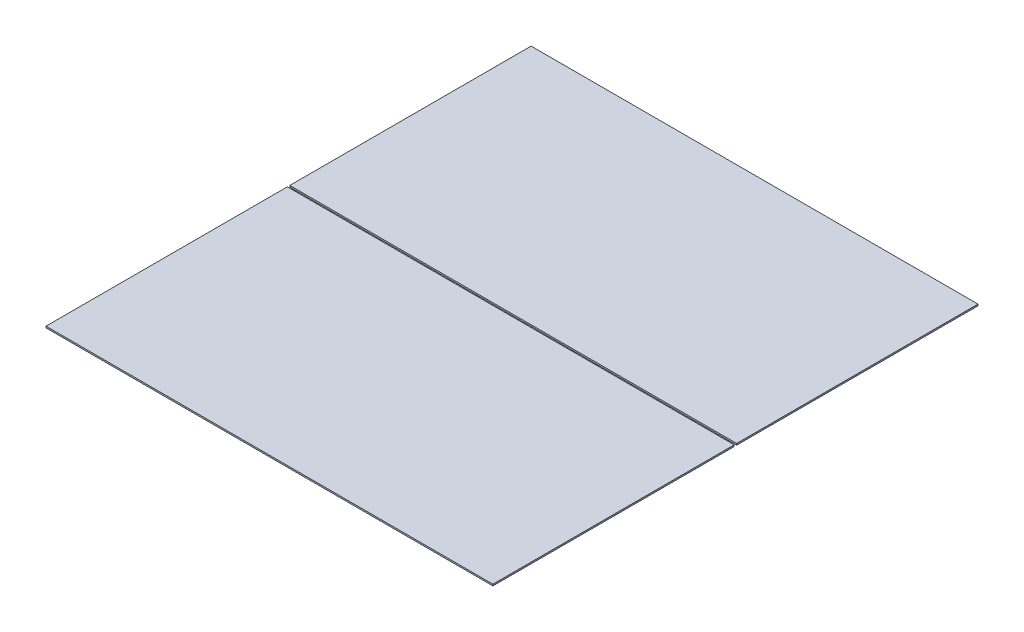
ISO-10303-21;
HEADER;
FILE_DESCRIPTION(('STEP AP214'),'2;1');
FILE_NAME('part.step','',(''),(''),'','','');
FILE_SCHEMA(('AUTOMOTIVE_DESIGN { 1 0 10303 214 1 1 1 1 }'));
ENDSEC;
DATA;
#1=APPLICATION_CONTEXT('core data for automotive mechanical design processes');
#2=APPLICATION_PROTOCOL_DEFINITION('international standard','automotive_design',2000,#1);
#3=PRODUCT_CONTEXT('',#1,'mechanical');
#4=PRODUCT('Part','Part','',(#3));
#5=PRODUCT_RELATED_PRODUCT_CATEGORY('part','',(#4));
#6=PRODUCT_DEFINITION_FORMATION('','',#4);
#7=PRODUCT_DEFINITION_CONTEXT('part definition',#1,'design');
#8=PRODUCT_DEFINITION('design','',#6,#7);
#9=PRODUCT_DEFINITION_SHAPE('','',#8);
#10=(LENGTH_UNIT() NAMED_UNIT(*) SI_UNIT(.MILLI.,.METRE.));
#11=(NAMED_UNIT(*) PLANE_ANGLE_UNIT() SI_UNIT($,.RADIAN.));
#12=(NAMED_UNIT(*) SI_UNIT($,.STERADIAN.) SOLID_ANGLE_UNIT());
#13=UNCERTAINTY_MEASURE_WITH_UNIT(LENGTH_MEASURE(1.E-05),#10,'distance_accuracy_value','');
#14=(GEOMETRIC_REPRESENTATION_CONTEXT(3) GLOBAL_UNCERTAINTY_ASSIGNED_CONTEXT((#13)) GLOBAL_UNIT_ASSIGNED_CONTEXT((#10,
#11,#12)) REPRESENTATION_CONTEXT('',''));
#15=CARTESIAN_POINT('',(0.,0.,0.));
#16=DIRECTION('',(0.,0.,1.));
#17=DIRECTION('',(1.,0.,0.));
#18=AXIS2_PLACEMENT_3D('',#15,#16,#17);
#19=CARTESIAN_POINT('',(0.,-2.5,0.));
#20=DIRECTION('',(0.,-1.,0.));
#21=DIRECTION('',(0.,0.,-1.));
#22=AXIS2_PLACEMENT_3D('',#19,#20,#21);
#23=PLANE('',#22);
#24=DIRECTION('',(0.,0.,-1.));
#25=VECTOR('',#24,1.);
#26=CARTESIAN_POINT('',(742.600000000003,-2.49999999999995,806.1));
#27=LINE('',#26,#25);
#28=CARTESIAN_POINT('',(742.600000000003,-2.49999999999995,806.1));
#29=VERTEX_POINT('',#28);
#30=CARTESIAN_POINT('',(742.600000000003,-2.49999999999995,4.00000000000004));
#31=VERTEX_POINT('',#30);
#32=EDGE_CURVE('E105',#29,#31,#27,.T.);
#33=ORIENTED_EDGE('',*,*,#32,.F.);
#34=DIRECTION('',(1.,0.,0.));
#35=VECTOR('',#34,1.);
#36=CARTESIAN_POINT('',(742.600000000003,-2.49999999999995,806.1));
#37=LINE('',#36,#35);
#38=CARTESIAN_POINT('',(-742.600000000001,-2.49999999999995,806.1));
#39=VERTEX_POINT('',#38);
#40=EDGE_CURVE('E97',#39,#29,#37,.T.);
#41=ORIENTED_EDGE('',*,*,#40,.F.);
#42=DIRECTION('',(0.,0.,1.));
#43=VECTOR('',#42,1.);
#44=CARTESIAN_POINT('',(-742.600000000001,-2.49999999999995,806.1));
#45=LINE('',#44,#43);
#46=CARTESIAN_POINT('',(-742.599999999994,-2.49999999999995,4.00000000000023));
#47=VERTEX_POINT('',#46);
#48=EDGE_CURVE('E83',#47,#39,#45,.T.);
#49=ORIENTED_EDGE('',*,*,#48,.F.);
#50=DIRECTION('',(-1.,0.,0.));
#51=VECTOR('',#50,1.);
#52=CARTESIAN_POINT('',(742.600000000003,-2.49999999999995,4.00000000000004));
#53=LINE('',#52,#51);
#54=EDGE_CURVE('E94',#31,#47,#53,.T.);
#55=ORIENTED_EDGE('',*,*,#54,.F.);
#56=EDGE_LOOP('',(#33,#41,#49,#55));
#57=FACE_BOUND('',#56,.T.);
#58=ADVANCED_FACE('F43',(#57),#23,.T.);
#59=CARTESIAN_POINT('',(742.600000000003,1690.45244305046,806.1));
#60=DIRECTION('',(-1.,0.,0.));
#61=DIRECTION('',(0.,0.,1.));
#62=AXIS2_PLACEMENT_3D('',#59,#60,#61);
#63=PLANE('',#62);
#64=DIRECTION('',(0.,-1.,0.));
#65=VECTOR('',#64,1.);
#66=CARTESIAN_POINT('',(742.600000000003,1690.45244305046,4.00000000000004));
#67=LINE('',#66,#65);
#68=CARTESIAN_POINT('',(742.600000000003,2.49999999999995,4.00000000000004));
#69=VERTEX_POINT('',#68);
#70=EDGE_CURVE('E100',#69,#31,#67,.T.);
#71=ORIENTED_EDGE('',*,*,#70,.F.);
#72=DIRECTION('',(0.,0.,1.));
#73=VECTOR('',#72,1.);
#74=CARTESIAN_POINT('',(742.600000000003,2.49999999999995,806.1));
#75=LINE('',#74,#73);
#76=CARTESIAN_POINT('',(742.600000000003,2.49999999999995,806.1));
#77=VERTEX_POINT('',#76);
#78=EDGE_CURVE('E59',#69,#77,#75,.T.);
#79=ORIENTED_EDGE('',*,*,#78,.T.);
#80=DIRECTION('',(0.,-1.,0.));
#81=VECTOR('',#80,1.);
#82=CARTESIAN_POINT('',(742.600000000003,1690.45244305046,806.1));
#83=LINE('',#82,#81);
#84=EDGE_CURVE('E102',#77,#29,#83,.T.);
#85=ORIENTED_EDGE('',*,*,#84,.T.);
#86=ORIENTED_EDGE('',*,*,#32,.T.);
#87=EDGE_LOOP('',(#71,#79,#85,#86));
#88=FACE_BOUND('',#87,.T.);
#89=ADVANCED_FACE('F117',(#88),#63,.F.);
#90=CARTESIAN_POINT('',(742.600000000003,1690.45244305046,4.00000000000004));
#91=DIRECTION('',(0.,0.,1.));
#92=DIRECTION('',(1.,0.,0.));
#93=AXIS2_PLACEMENT_3D('',#90,#91,#92);
#94=PLANE('',#93);
#95=DIRECTION('',(0.,-1.,0.));
#96=VECTOR('',#95,1.);
#97=CARTESIAN_POINT('',(-742.599999999994,1690.45244305046,4.00000000000023));
#98=LINE('',#97,#96);
#99=CARTESIAN_POINT('',(-742.599999999994,2.49999999999995,4.00000000000023));
#100=VERTEX_POINT('',#99);
#101=EDGE_CURVE('E79',#100,#47,#98,.T.);
#102=ORIENTED_EDGE('',*,*,#101,.F.);
#103=DIRECTION('',(1.,0.,0.));
#104=VECTOR('',#103,1.);
#105=CARTESIAN_POINT('',(742.600000000003,2.49999999999995,4.00000000000004));
#106=LINE('',#105,#104);
#107=EDGE_CURVE('E108',#100,#69,#106,.T.);
#108=ORIENTED_EDGE('',*,*,#107,.T.);
#109=ORIENTED_EDGE('',*,*,#70,.T.);
#110=ORIENTED_EDGE('',*,*,#54,.T.);
#111=EDGE_LOOP('',(#102,#108,#109,#110));
#112=FACE_BOUND('',#111,.T.);
#113=ADVANCED_FACE('F99',(#112),#94,.F.);
#114=CARTESIAN_POINT('',(-742.600000000001,1690.45244305046,806.1));
#115=DIRECTION('',(1.,0.,0.));
#116=DIRECTION('',(0.,0.,-1.));
#117=AXIS2_PLACEMENT_3D('',#114,#115,#116);
#118=PLANE('',#117);
#119=DIRECTION('',(0.,-1.,0.));
#120=VECTOR('',#119,1.);
#121=CARTESIAN_POINT('',(-742.600000000001,1690.45244305046,806.1));
#122=LINE('',#121,#120);
#123=CARTESIAN_POINT('',(-742.600000000001,2.49999999999995,806.1));
#124=VERTEX_POINT('',#123);
#125=EDGE_CURVE('E12',#124,#39,#122,.T.);
#126=ORIENTED_EDGE('',*,*,#125,.F.);
#127=DIRECTION('',(0.,0.,-1.));
#128=VECTOR('',#127,1.);
#129=CARTESIAN_POINT('',(-742.600000000001,2.49999999999995,806.1));
#130=LINE('',#129,#128);
#131=EDGE_CURVE('E85',#124,#100,#130,.T.);
#132=ORIENTED_EDGE('',*,*,#131,.T.);
#133=ORIENTED_EDGE('',*,*,#101,.T.);
#134=ORIENTED_EDGE('',*,*,#48,.T.);
#135=EDGE_LOOP('',(#126,#132,#133,#134));
#136=FACE_BOUND('',#135,.T.);
#137=ADVANCED_FACE('F82',(#136),#118,.F.);
#138=CARTESIAN_POINT('',(742.600000000003,1690.45244305046,806.1));
#139=DIRECTION('',(0.,0.,-1.));
#140=DIRECTION('',(-1.,0.,0.));
#141=AXIS2_PLACEMENT_3D('',#138,#139,#140);
#142=PLANE('',#141);
#143=ORIENTED_EDGE('',*,*,#84,.F.);
#144=DIRECTION('',(-1.,0.,0.));
#145=VECTOR('',#144,1.);
#146=CARTESIAN_POINT('',(742.600000000003,2.49999999999995,806.1));
#147=LINE('',#146,#145);
#148=EDGE_CURVE('E46',#77,#124,#147,.T.);
#149=ORIENTED_EDGE('',*,*,#148,.T.);
#150=ORIENTED_EDGE('',*,*,#125,.T.);
#151=ORIENTED_EDGE('',*,*,#40,.T.);
#152=EDGE_LOOP('',(#143,#149,#150,#151));
#153=FACE_BOUND('',#152,.T.);
#154=ADVANCED_FACE('F115',(#153),#142,.F.);
#155=CARTESIAN_POINT('',(0.,2.5,0.));
#156=DIRECTION('',(0.,-1.,0.));
#157=DIRECTION('',(0.,0.,-1.));
#158=AXIS2_PLACEMENT_3D('',#155,#156,#157);
#159=PLANE('',#158);
#160=ORIENTED_EDGE('',*,*,#107,.F.);
#161=ORIENTED_EDGE('',*,*,#131,.F.);
#162=ORIENTED_EDGE('',*,*,#148,.F.);
#163=ORIENTED_EDGE('',*,*,#78,.F.);
#164=EDGE_LOOP('',(#160,#161,#162,#163));
#165=FACE_BOUND('',#164,.T.);
#166=ADVANCED_FACE('F111',(#165),#159,.F.);
#167=CLOSED_SHELL('',(#58,#89,#113,#137,#154,#166));
#168=MANIFOLD_SOLID_BREP('B2',#167);
#169=CARTESIAN_POINT('',(0.,-2.5,0.));
#170=DIRECTION('',(0.,-1.,0.));
#171=DIRECTION('',(0.,0.,-1.));
#172=AXIS2_PLACEMENT_3D('',#169,#170,#171);
#173=PLANE('',#172);
#174=DIRECTION('',(0.,0.,1.));
#175=VECTOR('',#174,1.);
#176=CARTESIAN_POINT('',(-742.600000000001,-2.49999999999995,-806.1));
#177=LINE('',#176,#175);
#178=CARTESIAN_POINT('',(-742.600000000001,-2.49999999999995,-806.1));
#179=VERTEX_POINT('',#178);
#180=CARTESIAN_POINT('',(-742.599999999993,-2.49999999999995,-3.99999999999996));
#181=VERTEX_POINT('',#180);
#182=EDGE_CURVE('E235',#179,#181,#177,.T.);
#183=ORIENTED_EDGE('',*,*,#182,.F.);
#184=DIRECTION('',(-1.,0.,0.));
#185=VECTOR('',#184,1.);
#186=CARTESIAN_POINT('',(-742.600000000001,-2.49999999999995,-806.1));
#187=LINE('',#186,#185);
#188=CARTESIAN_POINT('',(742.600000000003,-2.49999999999995,-806.1));
#189=VERTEX_POINT('',#188);
#190=EDGE_CURVE('E227',#189,#179,#187,.T.);
#191=ORIENTED_EDGE('',*,*,#190,.F.);
#192=DIRECTION('',(0.,0.,-1.));
#193=VECTOR('',#192,1.);
#194=CARTESIAN_POINT('',(742.600000000003,-2.49999999999995,-806.1));
#195=LINE('',#194,#193);
#196=CARTESIAN_POINT('',(742.600000000003,-2.49999999999995,-4.));
#197=VERTEX_POINT('',#196);
#198=EDGE_CURVE('E213',#197,#189,#195,.T.);
#199=ORIENTED_EDGE('',*,*,#198,.F.);
#200=DIRECTION('',(1.,0.,0.));
#201=VECTOR('',#200,1.);
#202=CARTESIAN_POINT('',(-742.599999999993,-2.49999999999995,-3.99999999999996));
#203=LINE('',#202,#201);
#204=EDGE_CURVE('E224',#181,#197,#203,.T.);
#205=ORIENTED_EDGE('',*,*,#204,.F.);
#206=EDGE_LOOP('',(#183,#191,#199,#205));
#207=FACE_BOUND('',#206,.T.);
#208=ADVANCED_FACE('F173',(#207),#173,.T.);
#209=CARTESIAN_POINT('',(-742.600000000001,1690.45244305046,-806.1));
#210=DIRECTION('',(1.,0.,0.));
#211=DIRECTION('',(0.,0.,-1.));
#212=AXIS2_PLACEMENT_3D('',#209,#210,#211);
#213=PLANE('',#212);
#214=DIRECTION('',(0.,-1.,0.));
#215=VECTOR('',#214,1.);
#216=CARTESIAN_POINT('',(-742.599999999993,1690.45244305046,-3.99999999999996));
#217=LINE('',#216,#215);
#218=CARTESIAN_POINT('',(-742.599999999993,2.49999999999995,-3.99999999999996));
#219=VERTEX_POINT('',#218);
#220=EDGE_CURVE('E230',#219,#181,#217,.T.);
#221=ORIENTED_EDGE('',*,*,#220,.F.);
#222=DIRECTION('',(0.,0.,-1.));
#223=VECTOR('',#222,1.);
#224=CARTESIAN_POINT('',(-742.600000000001,2.49999999999995,-806.1));
#225=LINE('',#224,#223);
#226=CARTESIAN_POINT('',(-742.600000000001,2.49999999999995,-806.1));
#227=VERTEX_POINT('',#226);
#228=EDGE_CURVE('E189',#219,#227,#225,.T.);
#229=ORIENTED_EDGE('',*,*,#228,.T.);
#230=DIRECTION('',(0.,-1.,0.));
#231=VECTOR('',#230,1.);
#232=CARTESIAN_POINT('',(-742.600000000001,1690.45244305046,-806.1));
#233=LINE('',#232,#231);
#234=EDGE_CURVE('E232',#227,#179,#233,.T.);
#235=ORIENTED_EDGE('',*,*,#234,.T.);
#236=ORIENTED_EDGE('',*,*,#182,.T.);
#237=EDGE_LOOP('',(#221,#229,#235,#236));
#238=FACE_BOUND('',#237,.T.);
#239=ADVANCED_FACE('F247',(#238),#213,.F.);
#240=CARTESIAN_POINT('',(-742.599999999993,1690.45244305046,-3.99999999999996));
#241=DIRECTION('',(0.,0.,-1.));
#242=DIRECTION('',(-1.,0.,0.));
#243=AXIS2_PLACEMENT_3D('',#240,#241,#242);
#244=PLANE('',#243);
#245=DIRECTION('',(0.,-1.,0.));
#246=VECTOR('',#245,1.);
#247=CARTESIAN_POINT('',(742.600000000003,1690.45244305046,-4.));
#248=LINE('',#247,#246);
#249=CARTESIAN_POINT('',(742.600000000003,2.49999999999995,-4.));
#250=VERTEX_POINT('',#249);
#251=EDGE_CURVE('E209',#250,#197,#248,.T.);
#252=ORIENTED_EDGE('',*,*,#251,.F.);
#253=DIRECTION('',(-1.,0.,0.));
#254=VECTOR('',#253,1.);
#255=CARTESIAN_POINT('',(-742.599999999993,2.49999999999995,-3.99999999999996));
#256=LINE('',#255,#254);
#257=EDGE_CURVE('E238',#250,#219,#256,.T.);
#258=ORIENTED_EDGE('',*,*,#257,.T.);
#259=ORIENTED_EDGE('',*,*,#220,.T.);
#260=ORIENTED_EDGE('',*,*,#204,.T.);
#261=EDGE_LOOP('',(#252,#258,#259,#260));
#262=FACE_BOUND('',#261,.T.);
#263=ADVANCED_FACE('F229',(#262),#244,.F.);
#264=CARTESIAN_POINT('',(742.600000000003,1690.45244305046,-806.1));
#265=DIRECTION('',(-1.,0.,0.));
#266=DIRECTION('',(0.,0.,1.));
#267=AXIS2_PLACEMENT_3D('',#264,#265,#266);
#268=PLANE('',#267);
#269=DIRECTION('',(0.,-1.,0.));
#270=VECTOR('',#269,1.);
#271=CARTESIAN_POINT('',(742.600000000003,1690.45244305046,-806.1));
#272=LINE('',#271,#270);
#273=CARTESIAN_POINT('',(742.600000000003,2.49999999999995,-806.1));
#274=VERTEX_POINT('',#273);
#275=EDGE_CURVE('E41',#274,#189,#272,.T.);
#276=ORIENTED_EDGE('',*,*,#275,.F.);
#277=DIRECTION('',(0.,0.,1.));
#278=VECTOR('',#277,1.);
#279=CARTESIAN_POINT('',(742.600000000003,2.49999999999995,-806.1));
#280=LINE('',#279,#278);
#281=EDGE_CURVE('E215',#274,#250,#280,.T.);
#282=ORIENTED_EDGE('',*,*,#281,.T.);
#283=ORIENTED_EDGE('',*,*,#251,.T.);
#284=ORIENTED_EDGE('',*,*,#198,.T.);
#285=EDGE_LOOP('',(#276,#282,#283,#284));
#286=FACE_BOUND('',#285,.T.);
#287=ADVANCED_FACE('F212',(#286),#268,.F.);
#288=CARTESIAN_POINT('',(-742.600000000001,1690.45244305046,-806.1));
#289=DIRECTION('',(0.,0.,1.));
#290=DIRECTION('',(1.,0.,0.));
#291=AXIS2_PLACEMENT_3D('',#288,#289,#290);
#292=PLANE('',#291);
#293=ORIENTED_EDGE('',*,*,#234,.F.);
#294=DIRECTION('',(1.,0.,0.));
#295=VECTOR('',#294,1.);
#296=CARTESIAN_POINT('',(-742.600000000001,2.49999999999995,-806.1));
#297=LINE('',#296,#295);
#298=EDGE_CURVE('E176',#227,#274,#297,.T.);
#299=ORIENTED_EDGE('',*,*,#298,.T.);
#300=ORIENTED_EDGE('',*,*,#275,.T.);
#301=ORIENTED_EDGE('',*,*,#190,.T.);
#302=EDGE_LOOP('',(#293,#299,#300,#301));
#303=FACE_BOUND('',#302,.T.);
#304=ADVANCED_FACE('F245',(#303),#292,.F.);
#305=CARTESIAN_POINT('',(0.,2.5,0.));
#306=DIRECTION('',(0.,-1.,0.));
#307=DIRECTION('',(0.,0.,-1.));
#308=AXIS2_PLACEMENT_3D('',#305,#306,#307);
#309=PLANE('',#308);
#310=ORIENTED_EDGE('',*,*,#257,.F.);
#311=ORIENTED_EDGE('',*,*,#281,.F.);
#312=ORIENTED_EDGE('',*,*,#298,.F.);
#313=ORIENTED_EDGE('',*,*,#228,.F.);
#314=EDGE_LOOP('',(#310,#311,#312,#313));
#315=FACE_BOUND('',#314,.T.);
#316=ADVANCED_FACE('F241',(#315),#309,.F.);
#317=CLOSED_SHELL('',(#208,#239,#263,#287,#304,#316));
#318=MANIFOLD_SOLID_BREP('B6',#317);
#319=ADVANCED_BREP_SHAPE_REPRESENTATION('',(#18,#168,#318),#14);
#320=SHAPE_DEFINITION_REPRESENTATION(#9,#319);
ENDSEC;
END-ISO-10303-21;
